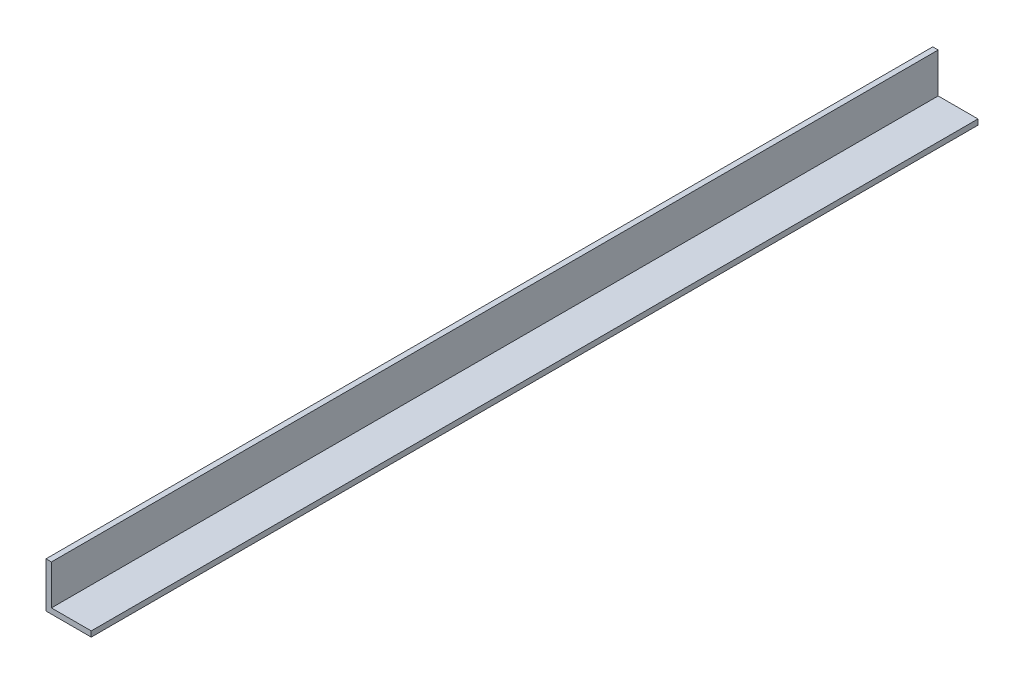
ISO-10303-21;
HEADER;
FILE_DESCRIPTION(('STEP AP214'),'2;1');
FILE_NAME('part.step','',(''),(''),'','','');
FILE_SCHEMA(('AUTOMOTIVE_DESIGN { 1 0 10303 214 1 1 1 1 }'));
ENDSEC;
DATA;
#1=APPLICATION_CONTEXT('core data for automotive mechanical design processes');
#2=APPLICATION_PROTOCOL_DEFINITION('international standard','automotive_design',2000,#1);
#3=PRODUCT_CONTEXT('',#1,'mechanical');
#4=PRODUCT('Part','Part','',(#3));
#5=PRODUCT_RELATED_PRODUCT_CATEGORY('part','',(#4));
#6=PRODUCT_DEFINITION_FORMATION('','',#4);
#7=PRODUCT_DEFINITION_CONTEXT('part definition',#1,'design');
#8=PRODUCT_DEFINITION('design','',#6,#7);
#9=PRODUCT_DEFINITION_SHAPE('','',#8);
#10=(LENGTH_UNIT() NAMED_UNIT(*) SI_UNIT(.MILLI.,.METRE.));
#11=(NAMED_UNIT(*) PLANE_ANGLE_UNIT() SI_UNIT($,.RADIAN.));
#12=(NAMED_UNIT(*) SI_UNIT($,.STERADIAN.) SOLID_ANGLE_UNIT());
#13=UNCERTAINTY_MEASURE_WITH_UNIT(LENGTH_MEASURE(1.E-05),#10,'distance_accuracy_value','');
#14=(GEOMETRIC_REPRESENTATION_CONTEXT(3) GLOBAL_UNCERTAINTY_ASSIGNED_CONTEXT((#13)) GLOBAL_UNIT_ASSIGNED_CONTEXT((#10,
#11,#12)) REPRESENTATION_CONTEXT('',''));
#15=CARTESIAN_POINT('',(0.,0.,0.));
#16=DIRECTION('',(0.,0.,1.));
#17=DIRECTION('',(1.,0.,0.));
#18=AXIS2_PLACEMENT_3D('',#15,#16,#17);
#19=CARTESIAN_POINT('',(0.,0.,1960.));
#20=DIRECTION('',(1.,0.,0.));
#21=DIRECTION('',(0.,0.,-1.));
#22=AXIS2_PLACEMENT_3D('',#19,#20,#21);
#23=PLANE('',#22);
#24=DIRECTION('',(0.,-1.,0.));
#25=VECTOR('',#24,1.);
#26=CARTESIAN_POINT('',(0.,0.,0.));
#27=LINE('',#26,#25);
#28=CARTESIAN_POINT('',(0.,100.,0.));
#29=VERTEX_POINT('',#28);
#30=CARTESIAN_POINT('',(0.,0.,0.));
#31=VERTEX_POINT('',#30);
#32=EDGE_CURVE('E106',#29,#31,#27,.T.);
#33=ORIENTED_EDGE('',*,*,#32,.T.);
#34=DIRECTION('',(0.,0.,-1.));
#35=VECTOR('',#34,1.);
#36=CARTESIAN_POINT('',(0.,0.,1960.));
#37=LINE('',#36,#35);
#38=CARTESIAN_POINT('',(0.,0.,1960.));
#39=VERTEX_POINT('',#38);
#40=EDGE_CURVE('E11',#39,#31,#37,.T.);
#41=ORIENTED_EDGE('',*,*,#40,.F.);
#42=DIRECTION('',(0.,-1.,0.));
#43=VECTOR('',#42,1.);
#44=CARTESIAN_POINT('',(0.,0.,1960.));
#45=LINE('',#44,#43);
#46=CARTESIAN_POINT('',(0.,100.,1960.));
#47=VERTEX_POINT('',#46);
#48=EDGE_CURVE('E107',#47,#39,#45,.T.);
#49=ORIENTED_EDGE('',*,*,#48,.F.);
#50=DIRECTION('',(0.,0.,-1.));
#51=VECTOR('',#50,1.);
#52=CARTESIAN_POINT('',(0.,100.,1960.));
#53=LINE('',#52,#51);
#54=EDGE_CURVE('E116',#47,#29,#53,.T.);
#55=ORIENTED_EDGE('',*,*,#54,.T.);
#56=EDGE_LOOP('',(#33,#41,#49,#55));
#57=FACE_BOUND('',#56,.T.);
#58=ADVANCED_FACE('F32',(#57),#23,.F.);
#59=CARTESIAN_POINT('',(0.,0.,1960.));
#60=DIRECTION('',(0.,1.,0.));
#61=DIRECTION('',(0.,0.,1.));
#62=AXIS2_PLACEMENT_3D('',#59,#60,#61);
#63=PLANE('',#62);
#64=DIRECTION('',(1.,0.,0.));
#65=VECTOR('',#64,1.);
#66=CARTESIAN_POINT('',(0.,0.,0.));
#67=LINE('',#66,#65);
#68=CARTESIAN_POINT('',(100.,0.,0.));
#69=VERTEX_POINT('',#68);
#70=EDGE_CURVE('E112',#31,#69,#67,.T.);
#71=ORIENTED_EDGE('',*,*,#70,.T.);
#72=DIRECTION('',(0.,0.,-1.));
#73=VECTOR('',#72,1.);
#74=CARTESIAN_POINT('',(100.,0.,1960.));
#75=LINE('',#74,#73);
#76=CARTESIAN_POINT('',(100.,0.,1960.));
#77=VERTEX_POINT('',#76);
#78=EDGE_CURVE('E39',#77,#69,#75,.T.);
#79=ORIENTED_EDGE('',*,*,#78,.F.);
#80=DIRECTION('',(1.,0.,0.));
#81=VECTOR('',#80,1.);
#82=CARTESIAN_POINT('',(0.,0.,1960.));
#83=LINE('',#82,#81);
#84=EDGE_CURVE('E78',#39,#77,#83,.T.);
#85=ORIENTED_EDGE('',*,*,#84,.F.);
#86=ORIENTED_EDGE('',*,*,#40,.T.);
#87=EDGE_LOOP('',(#71,#79,#85,#86));
#88=FACE_BOUND('',#87,.T.);
#89=ADVANCED_FACE('F136',(#88),#63,.F.);
#90=CARTESIAN_POINT('',(100.,0.,1960.));
#91=DIRECTION('',(-1.,0.,0.));
#92=DIRECTION('',(0.,0.,1.));
#93=AXIS2_PLACEMENT_3D('',#90,#91,#92);
#94=PLANE('',#93);
#95=DIRECTION('',(0.,1.,0.));
#96=VECTOR('',#95,1.);
#97=CARTESIAN_POINT('',(100.,0.,0.));
#98=LINE('',#97,#96);
#99=CARTESIAN_POINT('',(100.,12.,0.));
#100=VERTEX_POINT('',#99);
#101=EDGE_CURVE('E108',#69,#100,#98,.T.);
#102=ORIENTED_EDGE('',*,*,#101,.T.);
#103=DIRECTION('',(0.,0.,1.));
#104=VECTOR('',#103,1.);
#105=CARTESIAN_POINT('',(100.,12.,0.));
#106=LINE('',#105,#104);
#107=CARTESIAN_POINT('',(100.,12.,1960.));
#108=VERTEX_POINT('',#107);
#109=EDGE_CURVE('E130',#100,#108,#106,.T.);
#110=ORIENTED_EDGE('',*,*,#109,.T.);
#111=DIRECTION('',(0.,1.,0.));
#112=VECTOR('',#111,1.);
#113=CARTESIAN_POINT('',(100.,0.,1960.));
#114=LINE('',#113,#112);
#115=EDGE_CURVE('E124',#77,#108,#114,.T.);
#116=ORIENTED_EDGE('',*,*,#115,.F.);
#117=ORIENTED_EDGE('',*,*,#78,.T.);
#118=EDGE_LOOP('',(#102,#110,#116,#117));
#119=FACE_BOUND('',#118,.T.);
#120=ADVANCED_FACE('F121',(#119),#94,.F.);
#121=CARTESIAN_POINT('',(0.,100.,1960.));
#122=DIRECTION('',(0.,-1.,0.));
#123=DIRECTION('',(0.,0.,-1.));
#124=AXIS2_PLACEMENT_3D('',#121,#122,#123);
#125=PLANE('',#124);
#126=DIRECTION('',(-1.,0.,0.));
#127=VECTOR('',#126,1.);
#128=CARTESIAN_POINT('',(0.,100.,1960.));
#129=LINE('',#128,#127);
#130=CARTESIAN_POINT('',(12.,100.,1960.));
#131=VERTEX_POINT('',#130);
#132=EDGE_CURVE('E55',#131,#47,#129,.T.);
#133=ORIENTED_EDGE('',*,*,#132,.F.);
#134=DIRECTION('',(0.,0.,1.));
#135=VECTOR('',#134,1.);
#136=CARTESIAN_POINT('',(12.,100.,0.));
#137=LINE('',#136,#135);
#138=CARTESIAN_POINT('',(12.,100.,0.));
#139=VERTEX_POINT('',#138);
#140=EDGE_CURVE('E96',#139,#131,#137,.T.);
#141=ORIENTED_EDGE('',*,*,#140,.F.);
#142=DIRECTION('',(-1.,0.,0.));
#143=VECTOR('',#142,1.);
#144=CARTESIAN_POINT('',(0.,100.,0.));
#145=LINE('',#144,#143);
#146=EDGE_CURVE('E73',#139,#29,#145,.T.);
#147=ORIENTED_EDGE('',*,*,#146,.T.);
#148=ORIENTED_EDGE('',*,*,#54,.F.);
#149=EDGE_LOOP('',(#133,#141,#147,#148));
#150=FACE_BOUND('',#149,.T.);
#151=ADVANCED_FACE('F101',(#150),#125,.F.);
#152=CARTESIAN_POINT('',(0.,0.,1960.));
#153=DIRECTION('',(0.,0.,-1.));
#154=DIRECTION('',(-1.,0.,0.));
#155=AXIS2_PLACEMENT_3D('',#152,#153,#154);
#156=PLANE('',#155);
#157=ORIENTED_EDGE('',*,*,#115,.T.);
#158=DIRECTION('',(1.,0.,0.));
#159=VECTOR('',#158,1.);
#160=CARTESIAN_POINT('',(100.,12.,1960.));
#161=LINE('',#160,#159);
#162=CARTESIAN_POINT('',(12.,12.,1960.));
#163=VERTEX_POINT('',#162);
#164=EDGE_CURVE('E99',#163,#108,#161,.T.);
#165=ORIENTED_EDGE('',*,*,#164,.F.);
#166=DIRECTION('',(0.,-1.,0.));
#167=VECTOR('',#166,1.);
#168=CARTESIAN_POINT('',(12.,100.,1960.));
#169=LINE('',#168,#167);
#170=EDGE_CURVE('E127',#131,#163,#169,.T.);
#171=ORIENTED_EDGE('',*,*,#170,.F.);
#172=ORIENTED_EDGE('',*,*,#132,.T.);
#173=ORIENTED_EDGE('',*,*,#48,.T.);
#174=ORIENTED_EDGE('',*,*,#84,.T.);
#175=EDGE_LOOP('',(#157,#165,#171,#172,#173,#174));
#176=FACE_BOUND('',#175,.T.);
#177=ADVANCED_FACE('F140',(#176),#156,.F.);
#178=CARTESIAN_POINT('',(0.,0.,0.));
#179=DIRECTION('',(0.,0.,-1.));
#180=DIRECTION('',(-1.,0.,0.));
#181=AXIS2_PLACEMENT_3D('',#178,#179,#180);
#182=PLANE('',#181);
#183=DIRECTION('',(1.,0.,0.));
#184=VECTOR('',#183,1.);
#185=CARTESIAN_POINT('',(100.,12.,0.));
#186=LINE('',#185,#184);
#187=CARTESIAN_POINT('',(12.,12.,0.));
#188=VERTEX_POINT('',#187);
#189=EDGE_CURVE('E46',#188,#100,#186,.T.);
#190=ORIENTED_EDGE('',*,*,#189,.T.);
#191=ORIENTED_EDGE('',*,*,#101,.F.);
#192=ORIENTED_EDGE('',*,*,#70,.F.);
#193=ORIENTED_EDGE('',*,*,#32,.F.);
#194=ORIENTED_EDGE('',*,*,#146,.F.);
#195=DIRECTION('',(0.,-1.,0.));
#196=VECTOR('',#195,1.);
#197=CARTESIAN_POINT('',(12.,100.,0.));
#198=LINE('',#197,#196);
#199=EDGE_CURVE('E93',#139,#188,#198,.T.);
#200=ORIENTED_EDGE('',*,*,#199,.T.);
#201=EDGE_LOOP('',(#190,#191,#192,#193,#194,#200));
#202=FACE_BOUND('',#201,.T.);
#203=ADVANCED_FACE('F104',(#202),#182,.T.);
#204=CARTESIAN_POINT('',(100.,12.,0.));
#205=DIRECTION('',(0.,-1.,0.));
#206=DIRECTION('',(1.,0.,0.));
#207=AXIS2_PLACEMENT_3D('',#204,#205,#206);
#208=PLANE('',#207);
#209=ORIENTED_EDGE('',*,*,#164,.T.);
#210=ORIENTED_EDGE('',*,*,#109,.F.);
#211=ORIENTED_EDGE('',*,*,#189,.F.);
#212=DIRECTION('',(0.,0.,1.));
#213=VECTOR('',#212,1.);
#214=CARTESIAN_POINT('',(12.,12.,0.));
#215=LINE('',#214,#213);
#216=EDGE_CURVE('E97',#188,#163,#215,.T.);
#217=ORIENTED_EDGE('',*,*,#216,.T.);
#218=EDGE_LOOP('',(#209,#210,#211,#217));
#219=FACE_BOUND('',#218,.T.);
#220=ADVANCED_FACE('F142',(#219),#208,.F.);
#221=CARTESIAN_POINT('',(12.,100.,0.));
#222=DIRECTION('',(-1.,0.,0.));
#223=DIRECTION('',(0.,-1.,0.));
#224=AXIS2_PLACEMENT_3D('',#221,#222,#223);
#225=PLANE('',#224);
#226=ORIENTED_EDGE('',*,*,#170,.T.);
#227=ORIENTED_EDGE('',*,*,#216,.F.);
#228=ORIENTED_EDGE('',*,*,#199,.F.);
#229=ORIENTED_EDGE('',*,*,#140,.T.);
#230=EDGE_LOOP('',(#226,#227,#228,#229));
#231=FACE_BOUND('',#230,.T.);
#232=ADVANCED_FACE('F95',(#231),#225,.F.);
#233=CLOSED_SHELL('',(#58,#89,#120,#151,#177,#203,#220,#232));
#234=MANIFOLD_SOLID_BREP('B2',#233);
#235=ADVANCED_BREP_SHAPE_REPRESENTATION('',(#18,#234),#14);
#236=SHAPE_DEFINITION_REPRESENTATION(#9,#235);
ENDSEC;
END-ISO-10303-21;
